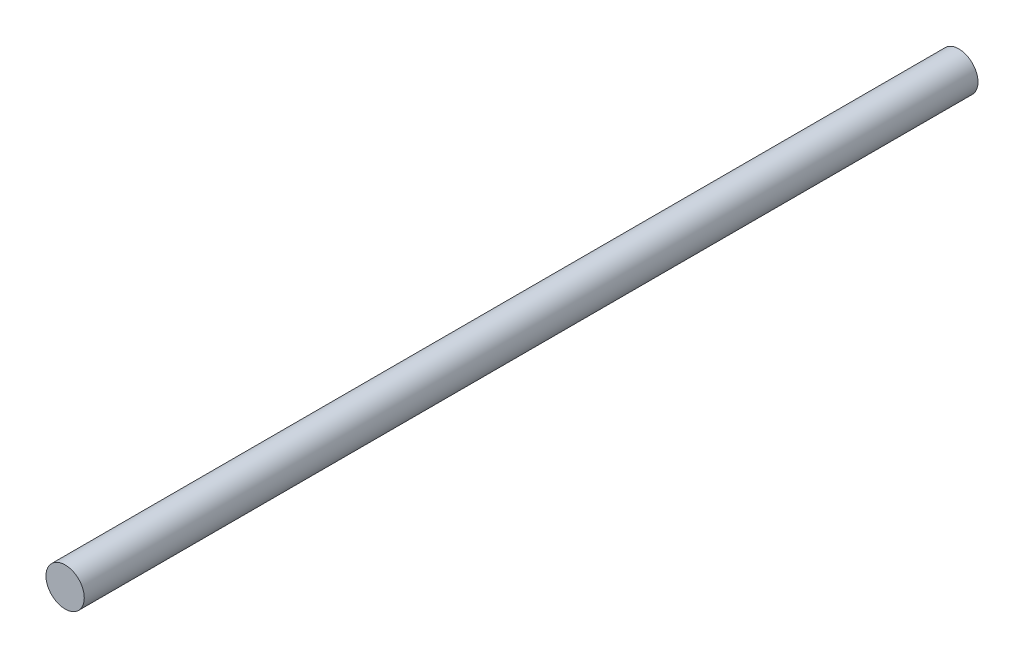
ISO-10303-21;
HEADER;
FILE_DESCRIPTION(('STEP AP214'),'2;1');
FILE_NAME('part.step','',(''),(''),'','','');
FILE_SCHEMA(('AUTOMOTIVE_DESIGN { 1 0 10303 214 1 1 1 1 }'));
ENDSEC;
DATA;
#1=APPLICATION_CONTEXT('core data for automotive mechanical design processes');
#2=APPLICATION_PROTOCOL_DEFINITION('international standard','automotive_design',2000,#1);
#3=PRODUCT_CONTEXT('',#1,'mechanical');
#4=PRODUCT('Part','Part','',(#3));
#5=PRODUCT_RELATED_PRODUCT_CATEGORY('part','',(#4));
#6=PRODUCT_DEFINITION_FORMATION('','',#4);
#7=PRODUCT_DEFINITION_CONTEXT('part definition',#1,'design');
#8=PRODUCT_DEFINITION('design','',#6,#7);
#9=PRODUCT_DEFINITION_SHAPE('','',#8);
#10=(LENGTH_UNIT() NAMED_UNIT(*) SI_UNIT(.MILLI.,.METRE.));
#11=(NAMED_UNIT(*) PLANE_ANGLE_UNIT() SI_UNIT($,.RADIAN.));
#12=(NAMED_UNIT(*) SI_UNIT($,.STERADIAN.) SOLID_ANGLE_UNIT());
#13=UNCERTAINTY_MEASURE_WITH_UNIT(LENGTH_MEASURE(1.E-05),#10,'distance_accuracy_value','');
#14=(GEOMETRIC_REPRESENTATION_CONTEXT(3) GLOBAL_UNCERTAINTY_ASSIGNED_CONTEXT((#13)) GLOBAL_UNIT_ASSIGNED_CONTEXT((#10,
#11,#12)) REPRESENTATION_CONTEXT('',''));
#15=CARTESIAN_POINT('',(0.,0.,0.));
#16=DIRECTION('',(0.,0.,1.));
#17=DIRECTION('',(1.,0.,0.));
#18=AXIS2_PLACEMENT_3D('',#15,#16,#17);
#19=CARTESIAN_POINT('',(0.,0.,350.));
#20=DIRECTION('',(0.,0.,-1.));
#21=DIRECTION('',(-1.,0.,0.));
#22=AXIS2_PLACEMENT_3D('',#19,#20,#21);
#23=CYLINDRICAL_SURFACE('',#22,7.5);
#24=CARTESIAN_POINT('',(0.,0.,350.));
#25=DIRECTION('',(0.,0.,1.));
#26=DIRECTION('',(1.,0.,0.));
#27=AXIS2_PLACEMENT_3D('',#24,#25,#26);
#28=CIRCLE('',#27,7.5);
#29=CARTESIAN_POINT('',(7.5,0.,350.));
#30=VERTEX_POINT('',#29);
#31=EDGE_CURVE('E10',#30,#30,#28,.T.);
#32=ORIENTED_EDGE('',*,*,#31,.F.);
#33=EDGE_LOOP('',(#32));
#34=FACE_BOUND('',#33,.T.);
#35=CARTESIAN_POINT('',(0.,0.,0.));
#36=DIRECTION('',(0.,0.,1.));
#37=DIRECTION('',(1.,0.,0.));
#38=AXIS2_PLACEMENT_3D('',#35,#36,#37);
#39=CIRCLE('',#38,7.5);
#40=CARTESIAN_POINT('',(7.5,0.,0.));
#41=VERTEX_POINT('',#40);
#42=EDGE_CURVE('E44',#41,#41,#39,.T.);
#43=ORIENTED_EDGE('',*,*,#42,.T.);
#44=EDGE_LOOP('',(#43));
#45=FACE_BOUND('',#44,.T.);
#46=ADVANCED_FACE('F41',(#34,#45),#23,.T.);
#47=CARTESIAN_POINT('',(0.,0.,350.));
#48=DIRECTION('',(0.,0.,1.));
#49=DIRECTION('',(1.,0.,0.));
#50=AXIS2_PLACEMENT_3D('',#47,#48,#49);
#51=PLANE('',#50);
#52=ORIENTED_EDGE('',*,*,#31,.T.);
#53=EDGE_LOOP('',(#52));
#54=FACE_BOUND('',#53,.T.);
#55=ADVANCED_FACE('F58',(#54),#51,.T.);
#56=CARTESIAN_POINT('',(0.,0.,0.));
#57=DIRECTION('',(0.,0.,1.));
#58=DIRECTION('',(1.,0.,0.));
#59=AXIS2_PLACEMENT_3D('',#56,#57,#58);
#60=PLANE('',#59);
#61=ORIENTED_EDGE('',*,*,#42,.F.);
#62=EDGE_LOOP('',(#61));
#63=FACE_BOUND('',#62,.T.);
#64=ADVANCED_FACE('F56',(#63),#60,.F.);
#65=CLOSED_SHELL('',(#46,#55,#64));
#66=MANIFOLD_SOLID_BREP('B2',#65);
#67=ADVANCED_BREP_SHAPE_REPRESENTATION('',(#18,#66),#14);
#68=SHAPE_DEFINITION_REPRESENTATION(#9,#67);
ENDSEC;
END-ISO-10303-21;
